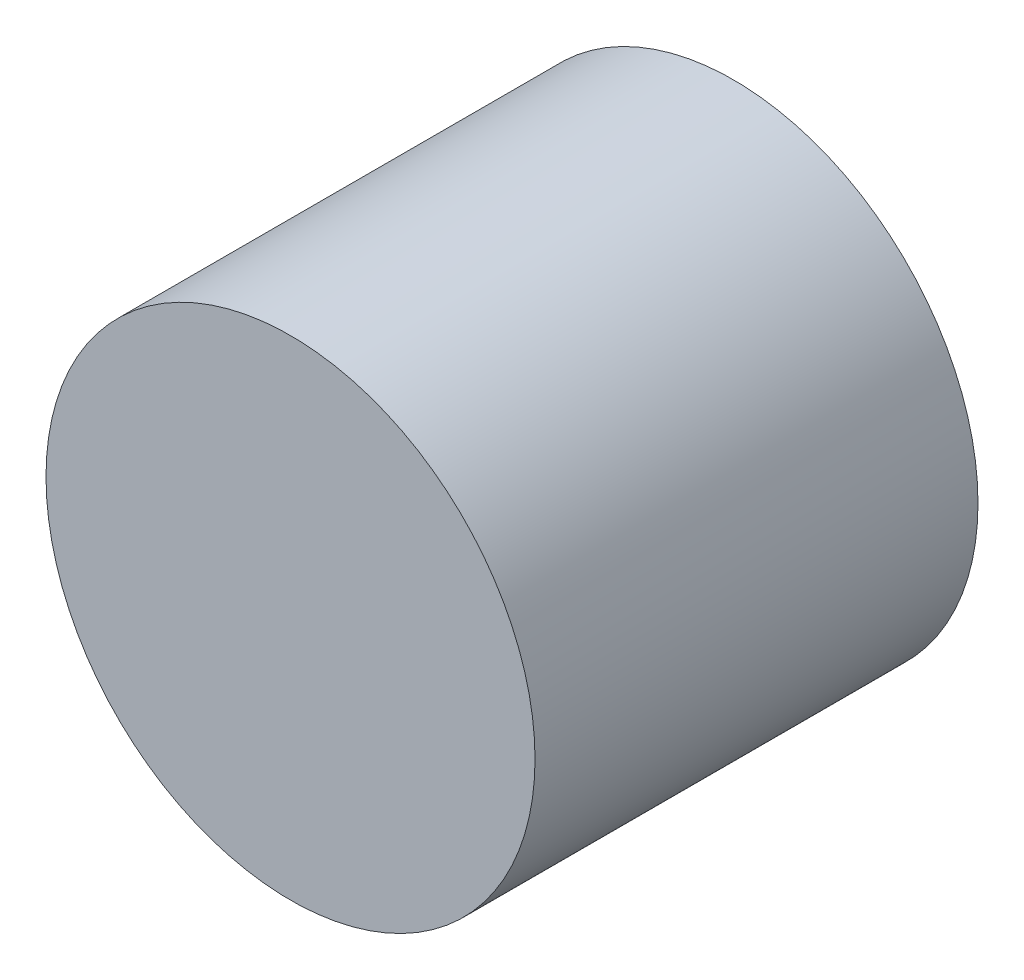
ISO-10303-21;
HEADER;
FILE_DESCRIPTION(('STEP AP214'),'2;1');
FILE_NAME('part.step','',(''),(''),'','','');
FILE_SCHEMA(('AUTOMOTIVE_DESIGN { 1 0 10303 214 1 1 1 1 }'));
ENDSEC;
DATA;
#1=APPLICATION_CONTEXT('core data for automotive mechanical design processes');
#2=APPLICATION_PROTOCOL_DEFINITION('international standard','automotive_design',2000,#1);
#3=PRODUCT_CONTEXT('',#1,'mechanical');
#4=PRODUCT('Part','Part','',(#3));
#5=PRODUCT_RELATED_PRODUCT_CATEGORY('part','',(#4));
#6=PRODUCT_DEFINITION_FORMATION('','',#4);
#7=PRODUCT_DEFINITION_CONTEXT('part definition',#1,'design');
#8=PRODUCT_DEFINITION('design','',#6,#7);
#9=PRODUCT_DEFINITION_SHAPE('','',#8);
#10=(LENGTH_UNIT() NAMED_UNIT(*) SI_UNIT(.MILLI.,.METRE.));
#11=(NAMED_UNIT(*) PLANE_ANGLE_UNIT() SI_UNIT($,.RADIAN.));
#12=(NAMED_UNIT(*) SI_UNIT($,.STERADIAN.) SOLID_ANGLE_UNIT());
#13=UNCERTAINTY_MEASURE_WITH_UNIT(LENGTH_MEASURE(1.E-05),#10,'distance_accuracy_value','');
#14=(GEOMETRIC_REPRESENTATION_CONTEXT(3) GLOBAL_UNCERTAINTY_ASSIGNED_CONTEXT((#13)) GLOBAL_UNIT_ASSIGNED_CONTEXT((#10,
#11,#12)) REPRESENTATION_CONTEXT('',''));
#15=CARTESIAN_POINT('',(0.,0.,0.));
#16=DIRECTION('',(0.,0.,1.));
#17=DIRECTION('',(1.,0.,0.));
#18=AXIS2_PLACEMENT_3D('',#15,#16,#17);
#19=CARTESIAN_POINT('',(0.,0.,25.));
#20=DIRECTION('',(0.,0.,-1.));
#21=DIRECTION('',(-1.,0.,0.));
#22=AXIS2_PLACEMENT_3D('',#19,#20,#21);
#23=CYLINDRICAL_SURFACE('',#22,13.8);
#24=CARTESIAN_POINT('',(0.,0.,25.));
#25=DIRECTION('',(0.,0.,1.));
#26=DIRECTION('',(1.,0.,0.));
#27=AXIS2_PLACEMENT_3D('',#24,#25,#26);
#28=CIRCLE('',#27,13.8);
#29=CARTESIAN_POINT('',(13.8,0.,25.));
#30=VERTEX_POINT('',#29);
#31=EDGE_CURVE('E10',#30,#30,#28,.T.);
#32=ORIENTED_EDGE('',*,*,#31,.F.);
#33=EDGE_LOOP('',(#32));
#34=FACE_BOUND('',#33,.T.);
#35=CARTESIAN_POINT('',(0.,0.,0.));
#36=DIRECTION('',(0.,0.,1.));
#37=DIRECTION('',(1.,0.,0.));
#38=AXIS2_PLACEMENT_3D('',#35,#36,#37);
#39=CIRCLE('',#38,13.8);
#40=CARTESIAN_POINT('',(13.8,0.,0.));
#41=VERTEX_POINT('',#40);
#42=EDGE_CURVE('E42',#41,#41,#39,.T.);
#43=ORIENTED_EDGE('',*,*,#42,.T.);
#44=EDGE_LOOP('',(#43));
#45=FACE_BOUND('',#44,.T.);
#46=ADVANCED_FACE('F39',(#34,#45),#23,.T.);
#47=CARTESIAN_POINT('',(0.,0.,25.));
#48=DIRECTION('',(0.,0.,1.));
#49=DIRECTION('',(1.,0.,0.));
#50=AXIS2_PLACEMENT_3D('',#47,#48,#49);
#51=PLANE('',#50);
#52=ORIENTED_EDGE('',*,*,#31,.T.);
#53=EDGE_LOOP('',(#52));
#54=FACE_BOUND('',#53,.T.);
#55=ADVANCED_FACE('F54',(#54),#51,.T.);
#56=CARTESIAN_POINT('',(0.,0.,0.));
#57=DIRECTION('',(0.,0.,1.));
#58=DIRECTION('',(1.,0.,0.));
#59=AXIS2_PLACEMENT_3D('',#56,#57,#58);
#60=PLANE('',#59);
#61=ORIENTED_EDGE('',*,*,#42,.F.);
#62=EDGE_LOOP('',(#61));
#63=FACE_BOUND('',#62,.T.);
#64=ADVANCED_FACE('F52',(#63),#60,.F.);
#65=CLOSED_SHELL('',(#46,#55,#64));
#66=MANIFOLD_SOLID_BREP('B2',#65);
#67=ADVANCED_BREP_SHAPE_REPRESENTATION('',(#18,#66),#14);
#68=SHAPE_DEFINITION_REPRESENTATION(#9,#67);
ENDSEC;
END-ISO-10303-21;
